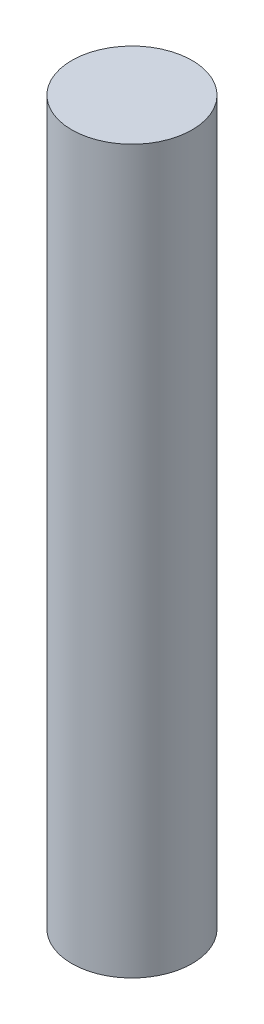
ISO-10303-21;
HEADER;
FILE_DESCRIPTION(('STEP AP214'),'2;1');
FILE_NAME('part.step','',(''),(''),'','','');
FILE_SCHEMA(('AUTOMOTIVE_DESIGN { 1 0 10303 214 1 1 1 1 }'));
ENDSEC;
DATA;
#1=APPLICATION_CONTEXT('core data for automotive mechanical design processes');
#2=APPLICATION_PROTOCOL_DEFINITION('international standard','automotive_design',2000,#1);
#3=PRODUCT_CONTEXT('',#1,'mechanical');
#4=PRODUCT('Part','Part','',(#3));
#5=PRODUCT_RELATED_PRODUCT_CATEGORY('part','',(#4));
#6=PRODUCT_DEFINITION_FORMATION('','',#4);
#7=PRODUCT_DEFINITION_CONTEXT('part definition',#1,'design');
#8=PRODUCT_DEFINITION('design','',#6,#7);
#9=PRODUCT_DEFINITION_SHAPE('','',#8);
#10=(LENGTH_UNIT() NAMED_UNIT(*) SI_UNIT(.MILLI.,.METRE.));
#11=(NAMED_UNIT(*) PLANE_ANGLE_UNIT() SI_UNIT($,.RADIAN.));
#12=(NAMED_UNIT(*) SI_UNIT($,.STERADIAN.) SOLID_ANGLE_UNIT());
#13=UNCERTAINTY_MEASURE_WITH_UNIT(LENGTH_MEASURE(1.E-05),#10,'distance_accuracy_value','');
#14=(GEOMETRIC_REPRESENTATION_CONTEXT(3) GLOBAL_UNCERTAINTY_ASSIGNED_CONTEXT((#13)) GLOBAL_UNIT_ASSIGNED_CONTEXT((#10,
#11,#12)) REPRESENTATION_CONTEXT('',''));
#15=CARTESIAN_POINT('',(0.,0.,0.));
#16=DIRECTION('',(0.,0.,1.));
#17=DIRECTION('',(1.,0.,0.));
#18=AXIS2_PLACEMENT_3D('',#15,#16,#17);
#19=CARTESIAN_POINT('',(0.,25.4,0.));
#20=DIRECTION('',(0.,-1.,0.));
#21=DIRECTION('',(0.,0.,-1.));
#22=AXIS2_PLACEMENT_3D('',#19,#20,#21);
#23=CYLINDRICAL_SURFACE('',#22,2.11666666666667);
#24=CARTESIAN_POINT('',(0.,25.4,0.));
#25=DIRECTION('',(0.,1.,0.));
#26=DIRECTION('',(0.,0.,1.));
#27=AXIS2_PLACEMENT_3D('',#24,#25,#26);
#28=CIRCLE('',#27,2.11666666666667);
#29=CARTESIAN_POINT('',(0.,25.4,2.11666666666667));
#30=VERTEX_POINT('',#29);
#31=EDGE_CURVE('E10',#30,#30,#28,.T.);
#32=ORIENTED_EDGE('',*,*,#31,.F.);
#33=EDGE_LOOP('',(#32));
#34=FACE_BOUND('',#33,.T.);
#35=CARTESIAN_POINT('',(0.,0.,0.));
#36=DIRECTION('',(0.,1.,0.));
#37=DIRECTION('',(0.,0.,1.));
#38=AXIS2_PLACEMENT_3D('',#35,#36,#37);
#39=CIRCLE('',#38,2.11666666666667);
#40=CARTESIAN_POINT('',(0.,0.,2.11666666666667));
#41=VERTEX_POINT('',#40);
#42=EDGE_CURVE('E33',#41,#41,#39,.T.);
#43=ORIENTED_EDGE('',*,*,#42,.T.);
#44=EDGE_LOOP('',(#43));
#45=FACE_BOUND('',#44,.T.);
#46=ADVANCED_FACE('F30',(#34,#45),#23,.T.);
#47=CARTESIAN_POINT('',(0.,25.4,0.));
#48=DIRECTION('',(0.,1.,0.));
#49=DIRECTION('',(0.,0.,1.));
#50=AXIS2_PLACEMENT_3D('',#47,#48,#49);
#51=PLANE('',#50);
#52=ORIENTED_EDGE('',*,*,#31,.T.);
#53=EDGE_LOOP('',(#52));
#54=FACE_BOUND('',#53,.T.);
#55=ADVANCED_FACE('F45',(#54),#51,.T.);
#56=CARTESIAN_POINT('',(0.,0.,0.));
#57=DIRECTION('',(0.,1.,0.));
#58=DIRECTION('',(0.,0.,1.));
#59=AXIS2_PLACEMENT_3D('',#56,#57,#58);
#60=PLANE('',#59);
#61=ORIENTED_EDGE('',*,*,#42,.F.);
#62=EDGE_LOOP('',(#61));
#63=FACE_BOUND('',#62,.T.);
#64=ADVANCED_FACE('F43',(#63),#60,.F.);
#65=CLOSED_SHELL('',(#46,#55,#64));
#66=MANIFOLD_SOLID_BREP('B2',#65);
#67=ADVANCED_BREP_SHAPE_REPRESENTATION('',(#18,#66),#14);
#68=SHAPE_DEFINITION_REPRESENTATION(#9,#67);
ENDSEC;
END-ISO-10303-21;
